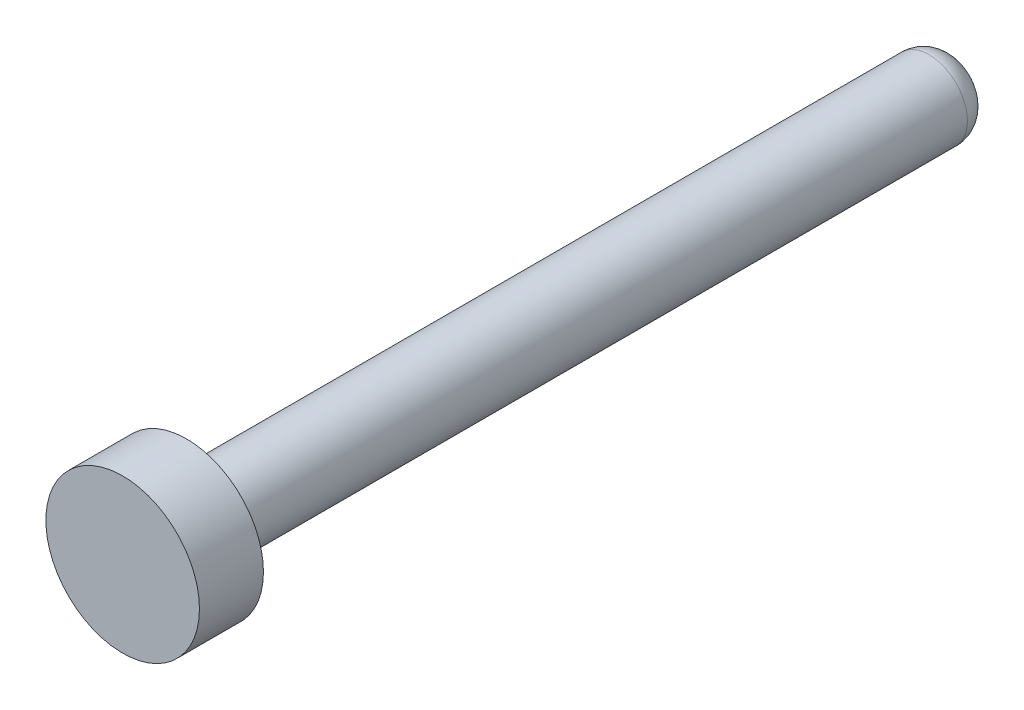
ISO-10303-21;
HEADER;
FILE_DESCRIPTION(('STEP AP214'),'2;1');
FILE_NAME('part.step','',(''),(''),'','','');
FILE_SCHEMA(('AUTOMOTIVE_DESIGN { 1 0 10303 214 1 1 1 1 }'));
ENDSEC;
DATA;
#1=APPLICATION_CONTEXT('core data for automotive mechanical design processes');
#2=APPLICATION_PROTOCOL_DEFINITION('international standard','automotive_design',2000,#1);
#3=PRODUCT_CONTEXT('',#1,'mechanical');
#4=PRODUCT('Part','Part','',(#3));
#5=PRODUCT_RELATED_PRODUCT_CATEGORY('part','',(#4));
#6=PRODUCT_DEFINITION_FORMATION('','',#4);
#7=PRODUCT_DEFINITION_CONTEXT('part definition',#1,'design');
#8=PRODUCT_DEFINITION('design','',#6,#7);
#9=PRODUCT_DEFINITION_SHAPE('','',#8);
#10=(LENGTH_UNIT() NAMED_UNIT(*) SI_UNIT(.MILLI.,.METRE.));
#11=(NAMED_UNIT(*) PLANE_ANGLE_UNIT() SI_UNIT($,.RADIAN.));
#12=(NAMED_UNIT(*) SI_UNIT($,.STERADIAN.) SOLID_ANGLE_UNIT());
#13=UNCERTAINTY_MEASURE_WITH_UNIT(LENGTH_MEASURE(1.E-05),#10,'distance_accuracy_value','');
#14=(GEOMETRIC_REPRESENTATION_CONTEXT(3) GLOBAL_UNCERTAINTY_ASSIGNED_CONTEXT((#13)) GLOBAL_UNIT_ASSIGNED_CONTEXT((#10,
#11,#12)) REPRESENTATION_CONTEXT('',''));
#15=CARTESIAN_POINT('',(0.,0.,0.));
#16=DIRECTION('',(0.,0.,1.));
#17=DIRECTION('',(1.,0.,0.));
#18=AXIS2_PLACEMENT_3D('',#15,#16,#17);
#19=CARTESIAN_POINT('',(0.,0.,65.));
#20=DIRECTION('',(0.,0.,-1.));
#21=DIRECTION('',(-1.,0.,0.));
#22=AXIS2_PLACEMENT_3D('',#19,#20,#21);
#23=CYLINDRICAL_SURFACE('',#22,3.);
#24=CARTESIAN_POINT('',(0.,0.,2.));
#25=DIRECTION('',(0.,0.,1.));
#26=DIRECTION('',(1.,0.,0.));
#27=AXIS2_PLACEMENT_3D('',#24,#25,#26);
#28=CIRCLE('',#27,3.);
#29=CARTESIAN_POINT('',(3.,0.,2.));
#30=VERTEX_POINT('',#29);
#31=EDGE_CURVE('E49',#30,#30,#28,.T.);
#32=ORIENTED_EDGE('',*,*,#31,.T.);
#33=EDGE_LOOP('',(#32));
#34=FACE_BOUND('',#33,.T.);
#35=CARTESIAN_POINT('',(0.,0.,60.));
#36=DIRECTION('',(0.,0.,1.));
#37=DIRECTION('',(1.,0.,0.));
#38=AXIS2_PLACEMENT_3D('',#35,#36,#37);
#39=CIRCLE('',#38,3.);
#40=CARTESIAN_POINT('',(3.,0.,60.));
#41=VERTEX_POINT('',#40);
#42=EDGE_CURVE('E54',#41,#41,#39,.T.);
#43=ORIENTED_EDGE('',*,*,#42,.F.);
#44=EDGE_LOOP('',(#43));
#45=FACE_BOUND('',#44,.T.);
#46=ADVANCED_FACE('F41',(#34,#45),#23,.T.);
#47=CARTESIAN_POINT('',(0.,0.,0.));
#48=DIRECTION('',(0.,0.,1.));
#49=DIRECTION('',(1.,0.,0.));
#50=AXIS2_PLACEMENT_3D('',#47,#48,#49);
#51=PLANE('',#50);
#52=CARTESIAN_POINT('',(0.,0.,0.));
#53=DIRECTION('',(0.,0.,1.));
#54=DIRECTION('',(1.,0.,0.));
#55=AXIS2_PLACEMENT_3D('',#52,#53,#54);
#56=CIRCLE('',#55,1.);
#57=CARTESIAN_POINT('',(1.,0.,0.));
#58=VERTEX_POINT('',#57);
#59=EDGE_CURVE('E10',#58,#58,#56,.F.);
#60=ORIENTED_EDGE('',*,*,#59,.T.);
#61=EDGE_LOOP('',(#60));
#62=FACE_BOUND('',#61,.T.);
#63=ADVANCED_FACE('F84',(#62),#51,.F.);
#64=CARTESIAN_POINT('',(0.,0.,60.));
#65=DIRECTION('',(0.,0.,1.));
#66=DIRECTION('',(1.,0.,0.));
#67=AXIS2_PLACEMENT_3D('',#64,#65,#66);
#68=CYLINDRICAL_SURFACE('',#67,6.);
#69=CARTESIAN_POINT('',(0.,0.,60.));
#70=DIRECTION('',(0.,0.,1.));
#71=DIRECTION('',(1.,0.,0.));
#72=AXIS2_PLACEMENT_3D('',#69,#70,#71);
#73=CIRCLE('',#72,6.);
#74=CARTESIAN_POINT('',(6.,0.,60.));
#75=VERTEX_POINT('',#74);
#76=EDGE_CURVE('E59',#75,#75,#73,.T.);
#77=ORIENTED_EDGE('',*,*,#76,.T.);
#78=EDGE_LOOP('',(#77));
#79=FACE_BOUND('',#78,.T.);
#80=CARTESIAN_POINT('',(0.,0.,65.));
#81=DIRECTION('',(0.,0.,1.));
#82=DIRECTION('',(1.,0.,0.));
#83=AXIS2_PLACEMENT_3D('',#80,#81,#82);
#84=CIRCLE('',#83,6.);
#85=CARTESIAN_POINT('',(6.,0.,65.));
#86=VERTEX_POINT('',#85);
#87=EDGE_CURVE('E62',#86,#86,#84,.T.);
#88=ORIENTED_EDGE('',*,*,#87,.F.);
#89=EDGE_LOOP('',(#88));
#90=FACE_BOUND('',#89,.T.);
#91=ADVANCED_FACE('F70',(#79,#90),#68,.T.);
#92=CARTESIAN_POINT('',(0.,0.,60.));
#93=DIRECTION('',(0.,0.,1.));
#94=DIRECTION('',(1.,0.,0.));
#95=AXIS2_PLACEMENT_3D('',#92,#93,#94);
#96=PLANE('',#95);
#97=ORIENTED_EDGE('',*,*,#42,.T.);
#98=EDGE_LOOP('',(#97));
#99=FACE_BOUND('',#98,.T.);
#100=ORIENTED_EDGE('',*,*,#76,.F.);
#101=EDGE_LOOP('',(#100));
#102=FACE_BOUND('',#101,.T.);
#103=ADVANCED_FACE('F73',(#99,#102),#96,.F.);
#104=CARTESIAN_POINT('',(0.,0.,65.));
#105=DIRECTION('',(0.,0.,1.));
#106=DIRECTION('',(1.,0.,0.));
#107=AXIS2_PLACEMENT_3D('',#104,#105,#106);
#108=PLANE('',#107);
#109=ORIENTED_EDGE('',*,*,#87,.T.);
#110=EDGE_LOOP('',(#109));
#111=FACE_BOUND('',#110,.T.);
#112=ADVANCED_FACE('F75',(#111),#108,.T.);
#113=CARTESIAN_POINT('',(0.,0.,2.));
#114=DIRECTION('',(0.,0.,1.));
#115=DIRECTION('',(1.,0.,0.));
#116=AXIS2_PLACEMENT_3D('',#113,#114,#115);
#117=DEGENERATE_TOROIDAL_SURFACE('',#116,1.,2.,.T.);
#118=ORIENTED_EDGE('',*,*,#59,.F.);
#119=EDGE_LOOP('',(#118));
#120=FACE_BOUND('',#119,.T.);
#121=ORIENTED_EDGE('',*,*,#31,.F.);
#122=EDGE_LOOP('',(#121));
#123=FACE_BOUND('',#122,.T.);
#124=ADVANCED_FACE('F43',(#120,#123),#117,.T.);
#125=CLOSED_SHELL('',(#46,#63,#91,#103,#112,#124));
#126=MANIFOLD_SOLID_BREP('B2',#125);
#127=ADVANCED_BREP_SHAPE_REPRESENTATION('',(#18,#126),#14);
#128=SHAPE_DEFINITION_REPRESENTATION(#9,#127);
ENDSEC;
END-ISO-10303-21;
